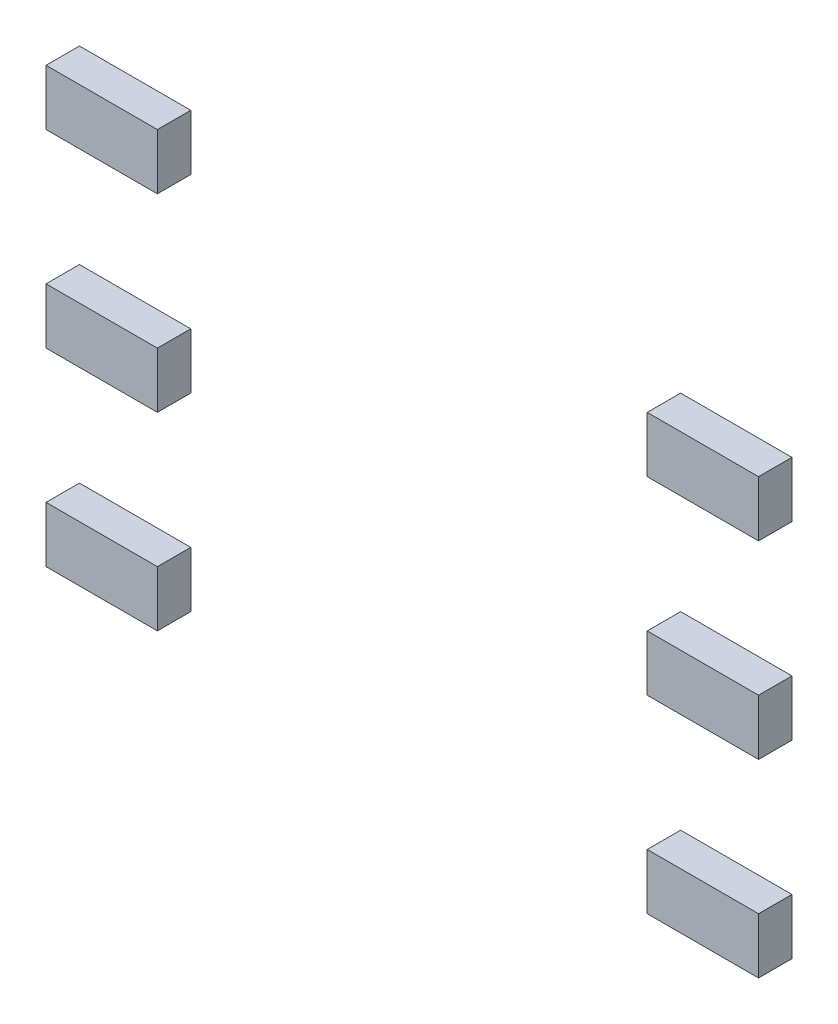
ISO-10303-21;
HEADER;
FILE_DESCRIPTION(('STEP AP214'),'2;1');
FILE_NAME('part.step','',(''),(''),'','','');
FILE_SCHEMA(('AUTOMOTIVE_DESIGN { 1 0 10303 214 1 1 1 1 }'));
ENDSEC;
DATA;
#1=APPLICATION_CONTEXT('core data for automotive mechanical design processes');
#2=APPLICATION_PROTOCOL_DEFINITION('international standard','automotive_design',2000,#1);
#3=PRODUCT_CONTEXT('',#1,'mechanical');
#4=PRODUCT('Part','Part','',(#3));
#5=PRODUCT_RELATED_PRODUCT_CATEGORY('part','',(#4));
#6=PRODUCT_DEFINITION_FORMATION('','',#4);
#7=PRODUCT_DEFINITION_CONTEXT('part definition',#1,'design');
#8=PRODUCT_DEFINITION('design','',#6,#7);
#9=PRODUCT_DEFINITION_SHAPE('','',#8);
#10=(LENGTH_UNIT() NAMED_UNIT(*) SI_UNIT(.MILLI.,.METRE.));
#11=(NAMED_UNIT(*) PLANE_ANGLE_UNIT() SI_UNIT($,.RADIAN.));
#12=(NAMED_UNIT(*) SI_UNIT($,.STERADIAN.) SOLID_ANGLE_UNIT());
#13=UNCERTAINTY_MEASURE_WITH_UNIT(LENGTH_MEASURE(1.E-05),#10,'distance_accuracy_value','');
#14=(GEOMETRIC_REPRESENTATION_CONTEXT(3) GLOBAL_UNCERTAINTY_ASSIGNED_CONTEXT((#13)) GLOBAL_UNIT_ASSIGNED_CONTEXT((#10,
#11,#12)) REPRESENTATION_CONTEXT('',''));
#15=CARTESIAN_POINT('',(0.,0.,0.));
#16=DIRECTION('',(0.,0.,1.));
#17=DIRECTION('',(1.,0.,0.));
#18=AXIS2_PLACEMENT_3D('',#15,#16,#17);
#19=CARTESIAN_POINT('',(-1.35,0.85,0.));
#20=DIRECTION('',(0.,0.,1.));
#21=DIRECTION('',(1.,0.,0.));
#22=AXIS2_PLACEMENT_3D('',#19,#20,#21);
#23=PLANE('',#22);
#24=DIRECTION('',(0.,-1.,0.));
#25=VECTOR('',#24,1.);
#26=CARTESIAN_POINT('',(-1.6,0.975,0.));
#27=LINE('',#26,#25);
#28=CARTESIAN_POINT('',(-1.6,0.975,0.));
#29=VERTEX_POINT('',#28);
#30=CARTESIAN_POINT('',(-1.6,0.725,0.));
#31=VERTEX_POINT('',#30);
#32=EDGE_CURVE('P0_E58',#29,#31,#27,.T.);
#33=ORIENTED_EDGE('',*,*,#32,.F.);
#34=DIRECTION('',(-1.,0.,0.));
#35=VECTOR('',#34,1.);
#36=CARTESIAN_POINT('',(-1.1,0.975,0.));
#37=LINE('',#36,#35);
#38=CARTESIAN_POINT('',(-1.1,0.975,0.));
#39=VERTEX_POINT('',#38);
#40=EDGE_CURVE('P0_E20',#39,#29,#37,.T.);
#41=ORIENTED_EDGE('',*,*,#40,.F.);
#42=DIRECTION('',(0.,1.,0.));
#43=VECTOR('',#42,1.);
#44=CARTESIAN_POINT('',(-1.1,0.725,0.));
#45=LINE('',#44,#43);
#46=CARTESIAN_POINT('',(-1.1,0.725,0.));
#47=VERTEX_POINT('',#46);
#48=EDGE_CURVE('P0_E88',#47,#39,#45,.T.);
#49=ORIENTED_EDGE('',*,*,#48,.F.);
#50=DIRECTION('',(1.,0.,0.));
#51=VECTOR('',#50,1.);
#52=CARTESIAN_POINT('',(-1.6,0.725,0.));
#53=LINE('',#52,#51);
#54=EDGE_CURVE('P0_E56',#31,#47,#53,.T.);
#55=ORIENTED_EDGE('',*,*,#54,.F.);
#56=EDGE_LOOP('',(#33,#41,#49,#55));
#57=FACE_BOUND('',#56,.T.);
#58=ADVANCED_FACE('P0_F17',(#57),#23,.F.);
#59=CARTESIAN_POINT('',(-1.1,0.975,0.));
#60=DIRECTION('',(0.,1.,0.));
#61=DIRECTION('',(-1.,0.,0.));
#62=AXIS2_PLACEMENT_3D('',#59,#60,#61);
#63=PLANE('',#62);
#64=DIRECTION('',(1.,0.,0.));
#65=VECTOR('',#64,1.);
#66=CARTESIAN_POINT('',(-1.35,0.975,0.15));
#67=LINE('',#66,#65);
#68=CARTESIAN_POINT('',(-1.1,0.975,0.15));
#69=VERTEX_POINT('',#68);
#70=CARTESIAN_POINT('',(-1.6,0.975,0.15));
#71=VERTEX_POINT('',#70);
#72=EDGE_CURVE('P0_E95',#69,#71,#67,.F.);
#73=ORIENTED_EDGE('',*,*,#72,.F.);
#74=DIRECTION('',(0.,0.,1.));
#75=VECTOR('',#74,1.);
#76=CARTESIAN_POINT('',(-1.1,0.975,0.));
#77=LINE('',#76,#75);
#78=EDGE_CURVE('P0_E70',#39,#69,#77,.T.);
#79=ORIENTED_EDGE('',*,*,#78,.F.);
#80=ORIENTED_EDGE('',*,*,#40,.T.);
#81=DIRECTION('',(0.,0.,1.));
#82=VECTOR('',#81,1.);
#83=CARTESIAN_POINT('',(-1.6,0.975,0.));
#84=LINE('',#83,#82);
#85=EDGE_CURVE('P0_E65',#71,#29,#84,.F.);
#86=ORIENTED_EDGE('',*,*,#85,.F.);
#87=EDGE_LOOP('',(#73,#79,#80,#86));
#88=FACE_BOUND('',#87,.T.);
#89=ADVANCED_FACE('P0_F67',(#88),#63,.T.);
#90=CARTESIAN_POINT('',(-1.6,0.975,0.));
#91=DIRECTION('',(-1.,0.,0.));
#92=DIRECTION('',(0.,-1.,0.));
#93=AXIS2_PLACEMENT_3D('',#90,#91,#92);
#94=PLANE('',#93);
#95=DIRECTION('',(0.,1.,0.));
#96=VECTOR('',#95,1.);
#97=CARTESIAN_POINT('',(-1.6,0.85,0.15));
#98=LINE('',#97,#96);
#99=CARTESIAN_POINT('',(-1.6,0.725,0.15));
#100=VERTEX_POINT('',#99);
#101=EDGE_CURVE('P0_E75',#71,#100,#98,.F.);
#102=ORIENTED_EDGE('',*,*,#101,.F.);
#103=ORIENTED_EDGE('',*,*,#85,.T.);
#104=ORIENTED_EDGE('',*,*,#32,.T.);
#105=DIRECTION('',(0.,0.,1.));
#106=VECTOR('',#105,1.);
#107=CARTESIAN_POINT('',(-1.6,0.725,0.));
#108=LINE('',#107,#106);
#109=EDGE_CURVE('P0_E83',#100,#31,#108,.F.);
#110=ORIENTED_EDGE('',*,*,#109,.F.);
#111=EDGE_LOOP('',(#102,#103,#104,#110));
#112=FACE_BOUND('',#111,.T.);
#113=ADVANCED_FACE('P0_F73',(#112),#94,.T.);
#114=CARTESIAN_POINT('',(-1.6,0.725,0.));
#115=DIRECTION('',(0.,-1.,0.));
#116=DIRECTION('',(1.,0.,0.));
#117=AXIS2_PLACEMENT_3D('',#114,#115,#116);
#118=PLANE('',#117);
#119=DIRECTION('',(1.,0.,0.));
#120=VECTOR('',#119,1.);
#121=CARTESIAN_POINT('',(-1.35,0.725,0.15));
#122=LINE('',#121,#120);
#123=CARTESIAN_POINT('',(-1.1,0.725,0.15));
#124=VERTEX_POINT('',#123);
#125=EDGE_CURVE('P0_E27',#100,#124,#122,.T.);
#126=ORIENTED_EDGE('',*,*,#125,.F.);
#127=ORIENTED_EDGE('',*,*,#109,.T.);
#128=ORIENTED_EDGE('',*,*,#54,.T.);
#129=DIRECTION('',(0.,0.,1.));
#130=VECTOR('',#129,1.);
#131=CARTESIAN_POINT('',(-1.1,0.725,0.));
#132=LINE('',#131,#130);
#133=EDGE_CURVE('P0_E36',#124,#47,#132,.F.);
#134=ORIENTED_EDGE('',*,*,#133,.F.);
#135=EDGE_LOOP('',(#126,#127,#128,#134));
#136=FACE_BOUND('',#135,.T.);
#137=ADVANCED_FACE('P0_F102',(#136),#118,.T.);
#138=CARTESIAN_POINT('',(-1.1,0.725,0.));
#139=DIRECTION('',(1.,0.,0.));
#140=DIRECTION('',(0.,1.,0.));
#141=AXIS2_PLACEMENT_3D('',#138,#139,#140);
#142=PLANE('',#141);
#143=DIRECTION('',(0.,1.,0.));
#144=VECTOR('',#143,1.);
#145=CARTESIAN_POINT('',(-1.1,0.85,0.15));
#146=LINE('',#145,#144);
#147=EDGE_CURVE('P0_E11',#124,#69,#146,.T.);
#148=ORIENTED_EDGE('',*,*,#147,.F.);
#149=ORIENTED_EDGE('',*,*,#133,.T.);
#150=ORIENTED_EDGE('',*,*,#48,.T.);
#151=ORIENTED_EDGE('',*,*,#78,.T.);
#152=EDGE_LOOP('',(#148,#149,#150,#151));
#153=FACE_BOUND('',#152,.T.);
#154=ADVANCED_FACE('P0_F104',(#153),#142,.T.);
#155=CARTESIAN_POINT('',(-1.35,0.85,0.15));
#156=DIRECTION('',(0.,0.,1.));
#157=DIRECTION('',(1.,0.,0.));
#158=AXIS2_PLACEMENT_3D('',#155,#156,#157);
#159=PLANE('',#158);
#160=ORIENTED_EDGE('',*,*,#125,.T.);
#161=ORIENTED_EDGE('',*,*,#147,.T.);
#162=ORIENTED_EDGE('',*,*,#72,.T.);
#163=ORIENTED_EDGE('',*,*,#101,.T.);
#164=EDGE_LOOP('',(#160,#161,#162,#163));
#165=FACE_BOUND('',#164,.T.);
#166=ADVANCED_FACE('P0_F101',(#165),#159,.T.);
#167=CLOSED_SHELL('',(#58,#89,#113,#137,#154,#166));
#168=MANIFOLD_SOLID_BREP('P0_B1',#167);
#169=CARTESIAN_POINT('',(1.35,-0.85,0.));
#170=DIRECTION('',(0.,0.,1.));
#171=DIRECTION('',(1.,0.,0.));
#172=AXIS2_PLACEMENT_3D('',#169,#170,#171);
#173=PLANE('',#172);
#174=DIRECTION('',(0.,1.,0.));
#175=VECTOR('',#174,1.);
#176=CARTESIAN_POINT('',(1.6,-0.975,0.));
#177=LINE('',#176,#175);
#178=CARTESIAN_POINT('',(1.6,-0.975,0.));
#179=VERTEX_POINT('',#178);
#180=CARTESIAN_POINT('',(1.6,-0.725,0.));
#181=VERTEX_POINT('',#180);
#182=EDGE_CURVE('P1_E58',#179,#181,#177,.T.);
#183=ORIENTED_EDGE('',*,*,#182,.F.);
#184=DIRECTION('',(1.,0.,0.));
#185=VECTOR('',#184,1.);
#186=CARTESIAN_POINT('',(1.1,-0.975,0.));
#187=LINE('',#186,#185);
#188=CARTESIAN_POINT('',(1.1,-0.975,0.));
#189=VERTEX_POINT('',#188);
#190=EDGE_CURVE('P1_E20',#189,#179,#187,.T.);
#191=ORIENTED_EDGE('',*,*,#190,.F.);
#192=DIRECTION('',(0.,1.,0.));
#193=VECTOR('',#192,1.);
#194=CARTESIAN_POINT('',(1.1,-0.725,0.));
#195=LINE('',#194,#193);
#196=CARTESIAN_POINT('',(1.1,-0.725,0.));
#197=VERTEX_POINT('',#196);
#198=EDGE_CURVE('P1_E87',#197,#189,#195,.F.);
#199=ORIENTED_EDGE('',*,*,#198,.F.);
#200=DIRECTION('',(1.,0.,0.));
#201=VECTOR('',#200,1.);
#202=CARTESIAN_POINT('',(1.6,-0.725,0.));
#203=LINE('',#202,#201);
#204=EDGE_CURVE('P1_E56',#181,#197,#203,.F.);
#205=ORIENTED_EDGE('',*,*,#204,.F.);
#206=EDGE_LOOP('',(#183,#191,#199,#205));
#207=FACE_BOUND('',#206,.T.);
#208=ADVANCED_FACE('P1_F17',(#207),#173,.F.);
#209=CARTESIAN_POINT('',(1.1,-0.975,0.));
#210=DIRECTION('',(0.,-1.,0.));
#211=DIRECTION('',(0.,0.,-1.));
#212=AXIS2_PLACEMENT_3D('',#209,#210,#211);
#213=PLANE('',#212);
#214=DIRECTION('',(1.,0.,0.));
#215=VECTOR('',#214,1.);
#216=CARTESIAN_POINT('',(1.35,-0.975,0.15));
#217=LINE('',#216,#215);
#218=CARTESIAN_POINT('',(1.1,-0.975,0.15));
#219=VERTEX_POINT('',#218);
#220=CARTESIAN_POINT('',(1.6,-0.975,0.15));
#221=VERTEX_POINT('',#220);
#222=EDGE_CURVE('P1_E94',#219,#221,#217,.T.);
#223=ORIENTED_EDGE('',*,*,#222,.F.);
#224=DIRECTION('',(0.,0.,1.));
#225=VECTOR('',#224,1.);
#226=CARTESIAN_POINT('',(1.1,-0.975,0.));
#227=LINE('',#226,#225);
#228=EDGE_CURVE('P1_E70',#189,#219,#227,.T.);
#229=ORIENTED_EDGE('',*,*,#228,.F.);
#230=ORIENTED_EDGE('',*,*,#190,.T.);
#231=DIRECTION('',(0.,0.,-1.));
#232=VECTOR('',#231,1.);
#233=CARTESIAN_POINT('',(1.6,-0.975,0.));
#234=LINE('',#233,#232);
#235=EDGE_CURVE('P1_E65',#221,#179,#234,.T.);
#236=ORIENTED_EDGE('',*,*,#235,.F.);
#237=EDGE_LOOP('',(#223,#229,#230,#236));
#238=FACE_BOUND('',#237,.T.);
#239=ADVANCED_FACE('P1_F67',(#238),#213,.T.);
#240=CARTESIAN_POINT('',(1.6,-0.975,0.));
#241=DIRECTION('',(1.,0.,0.));
#242=DIRECTION('',(0.,0.,-1.));
#243=AXIS2_PLACEMENT_3D('',#240,#241,#242);
#244=PLANE('',#243);
#245=DIRECTION('',(0.,1.,0.));
#246=VECTOR('',#245,1.);
#247=CARTESIAN_POINT('',(1.6,-0.85,0.15));
#248=LINE('',#247,#246);
#249=CARTESIAN_POINT('',(1.6,-0.725,0.15));
#250=VERTEX_POINT('',#249);
#251=EDGE_CURVE('P1_E75',#221,#250,#248,.T.);
#252=ORIENTED_EDGE('',*,*,#251,.F.);
#253=ORIENTED_EDGE('',*,*,#235,.T.);
#254=ORIENTED_EDGE('',*,*,#182,.T.);
#255=DIRECTION('',(0.,0.,1.));
#256=VECTOR('',#255,1.);
#257=CARTESIAN_POINT('',(1.6,-0.725,0.));
#258=LINE('',#257,#256);
#259=EDGE_CURVE('P1_E82',#250,#181,#258,.F.);
#260=ORIENTED_EDGE('',*,*,#259,.F.);
#261=EDGE_LOOP('',(#252,#253,#254,#260));
#262=FACE_BOUND('',#261,.T.);
#263=ADVANCED_FACE('P1_F73',(#262),#244,.T.);
#264=CARTESIAN_POINT('',(1.6,-0.725,0.));
#265=DIRECTION('',(0.,1.,0.));
#266=DIRECTION('',(0.,0.,1.));
#267=AXIS2_PLACEMENT_3D('',#264,#265,#266);
#268=PLANE('',#267);
#269=DIRECTION('',(1.,0.,0.));
#270=VECTOR('',#269,1.);
#271=CARTESIAN_POINT('',(1.35,-0.725,0.15));
#272=LINE('',#271,#270);
#273=CARTESIAN_POINT('',(1.1,-0.725,0.15));
#274=VERTEX_POINT('',#273);
#275=EDGE_CURVE('P1_E27',#250,#274,#272,.F.);
#276=ORIENTED_EDGE('',*,*,#275,.F.);
#277=ORIENTED_EDGE('',*,*,#259,.T.);
#278=ORIENTED_EDGE('',*,*,#204,.T.);
#279=DIRECTION('',(0.,0.,1.));
#280=VECTOR('',#279,1.);
#281=CARTESIAN_POINT('',(1.1,-0.725,0.));
#282=LINE('',#281,#280);
#283=EDGE_CURVE('P1_E36',#274,#197,#282,.F.);
#284=ORIENTED_EDGE('',*,*,#283,.F.);
#285=EDGE_LOOP('',(#276,#277,#278,#284));
#286=FACE_BOUND('',#285,.T.);
#287=ADVANCED_FACE('P1_F102',(#286),#268,.T.);
#288=CARTESIAN_POINT('',(1.1,-0.725,0.));
#289=DIRECTION('',(-1.,0.,0.));
#290=DIRECTION('',(0.,0.,1.));
#291=AXIS2_PLACEMENT_3D('',#288,#289,#290);
#292=PLANE('',#291);
#293=DIRECTION('',(0.,1.,0.));
#294=VECTOR('',#293,1.);
#295=CARTESIAN_POINT('',(1.1,-0.85,0.15));
#296=LINE('',#295,#294);
#297=EDGE_CURVE('P1_E11',#274,#219,#296,.F.);
#298=ORIENTED_EDGE('',*,*,#297,.F.);
#299=ORIENTED_EDGE('',*,*,#283,.T.);
#300=ORIENTED_EDGE('',*,*,#198,.T.);
#301=ORIENTED_EDGE('',*,*,#228,.T.);
#302=EDGE_LOOP('',(#298,#299,#300,#301));
#303=FACE_BOUND('',#302,.T.);
#304=ADVANCED_FACE('P1_F104',(#303),#292,.T.);
#305=CARTESIAN_POINT('',(1.35,-0.85,0.15));
#306=DIRECTION('',(0.,0.,1.));
#307=DIRECTION('',(1.,0.,0.));
#308=AXIS2_PLACEMENT_3D('',#305,#306,#307);
#309=PLANE('',#308);
#310=ORIENTED_EDGE('',*,*,#275,.T.);
#311=ORIENTED_EDGE('',*,*,#297,.T.);
#312=ORIENTED_EDGE('',*,*,#222,.T.);
#313=ORIENTED_EDGE('',*,*,#251,.T.);
#314=EDGE_LOOP('',(#310,#311,#312,#313));
#315=FACE_BOUND('',#314,.T.);
#316=ADVANCED_FACE('P1_F101',(#315),#309,.T.);
#317=CLOSED_SHELL('',(#208,#239,#263,#287,#304,#316));
#318=MANIFOLD_SOLID_BREP('P1_B1',#317);
#319=CARTESIAN_POINT('',(-1.35,-0.85,0.));
#320=DIRECTION('',(0.,0.,1.));
#321=DIRECTION('',(1.,0.,0.));
#322=AXIS2_PLACEMENT_3D('',#319,#320,#321);
#323=PLANE('',#322);
#324=DIRECTION('',(0.,-1.,0.));
#325=VECTOR('',#324,1.);
#326=CARTESIAN_POINT('',(-1.6,-0.725,0.));
#327=LINE('',#326,#325);
#328=CARTESIAN_POINT('',(-1.6,-0.725,0.));
#329=VERTEX_POINT('',#328);
#330=CARTESIAN_POINT('',(-1.6,-0.975,0.));
#331=VERTEX_POINT('',#330);
#332=EDGE_CURVE('P2_E58',#329,#331,#327,.T.);
#333=ORIENTED_EDGE('',*,*,#332,.F.);
#334=DIRECTION('',(-1.,0.,0.));
#335=VECTOR('',#334,1.);
#336=CARTESIAN_POINT('',(-1.1,-0.725,0.));
#337=LINE('',#336,#335);
#338=CARTESIAN_POINT('',(-1.1,-0.725,0.));
#339=VERTEX_POINT('',#338);
#340=EDGE_CURVE('P2_E20',#339,#329,#337,.T.);
#341=ORIENTED_EDGE('',*,*,#340,.F.);
#342=DIRECTION('',(0.,1.,0.));
#343=VECTOR('',#342,1.);
#344=CARTESIAN_POINT('',(-1.1,-0.975,0.));
#345=LINE('',#344,#343);
#346=CARTESIAN_POINT('',(-1.1,-0.975,0.));
#347=VERTEX_POINT('',#346);
#348=EDGE_CURVE('P2_E88',#347,#339,#345,.T.);
#349=ORIENTED_EDGE('',*,*,#348,.F.);
#350=DIRECTION('',(1.,0.,0.));
#351=VECTOR('',#350,1.);
#352=CARTESIAN_POINT('',(-1.6,-0.975,0.));
#353=LINE('',#352,#351);
#354=EDGE_CURVE('P2_E56',#331,#347,#353,.T.);
#355=ORIENTED_EDGE('',*,*,#354,.F.);
#356=EDGE_LOOP('',(#333,#341,#349,#355));
#357=FACE_BOUND('',#356,.T.);
#358=ADVANCED_FACE('P2_F17',(#357),#323,.F.);
#359=CARTESIAN_POINT('',(-1.1,-0.725,0.));
#360=DIRECTION('',(0.,1.,0.));
#361=DIRECTION('',(-1.,0.,0.));
#362=AXIS2_PLACEMENT_3D('',#359,#360,#361);
#363=PLANE('',#362);
#364=DIRECTION('',(1.,0.,0.));
#365=VECTOR('',#364,1.);
#366=CARTESIAN_POINT('',(-1.35,-0.725,0.15));
#367=LINE('',#366,#365);
#368=CARTESIAN_POINT('',(-1.1,-0.725,0.15));
#369=VERTEX_POINT('',#368);
#370=CARTESIAN_POINT('',(-1.6,-0.725,0.15));
#371=VERTEX_POINT('',#370);
#372=EDGE_CURVE('P2_E94',#369,#371,#367,.F.);
#373=ORIENTED_EDGE('',*,*,#372,.F.);
#374=DIRECTION('',(0.,0.,1.));
#375=VECTOR('',#374,1.);
#376=CARTESIAN_POINT('',(-1.1,-0.725,0.));
#377=LINE('',#376,#375);
#378=EDGE_CURVE('P2_E70',#339,#369,#377,.T.);
#379=ORIENTED_EDGE('',*,*,#378,.F.);
#380=ORIENTED_EDGE('',*,*,#340,.T.);
#381=DIRECTION('',(0.,0.,1.));
#382=VECTOR('',#381,1.);
#383=CARTESIAN_POINT('',(-1.6,-0.725,0.));
#384=LINE('',#383,#382);
#385=EDGE_CURVE('P2_E65',#371,#329,#384,.F.);
#386=ORIENTED_EDGE('',*,*,#385,.F.);
#387=EDGE_LOOP('',(#373,#379,#380,#386));
#388=FACE_BOUND('',#387,.T.);
#389=ADVANCED_FACE('P2_F67',(#388),#363,.T.);
#390=CARTESIAN_POINT('',(-1.6,-0.725,0.));
#391=DIRECTION('',(-1.,0.,0.));
#392=DIRECTION('',(0.,-1.,0.));
#393=AXIS2_PLACEMENT_3D('',#390,#391,#392);
#394=PLANE('',#393);
#395=DIRECTION('',(0.,1.,0.));
#396=VECTOR('',#395,1.);
#397=CARTESIAN_POINT('',(-1.6,-0.85,0.15));
#398=LINE('',#397,#396);
#399=CARTESIAN_POINT('',(-1.6,-0.975,0.15));
#400=VERTEX_POINT('',#399);
#401=EDGE_CURVE('P2_E75',#371,#400,#398,.F.);
#402=ORIENTED_EDGE('',*,*,#401,.F.);
#403=ORIENTED_EDGE('',*,*,#385,.T.);
#404=ORIENTED_EDGE('',*,*,#332,.T.);
#405=DIRECTION('',(0.,0.,1.));
#406=VECTOR('',#405,1.);
#407=CARTESIAN_POINT('',(-1.6,-0.975,0.));
#408=LINE('',#407,#406);
#409=EDGE_CURVE('P2_E83',#400,#331,#408,.F.);
#410=ORIENTED_EDGE('',*,*,#409,.F.);
#411=EDGE_LOOP('',(#402,#403,#404,#410));
#412=FACE_BOUND('',#411,.T.);
#413=ADVANCED_FACE('P2_F73',(#412),#394,.T.);
#414=CARTESIAN_POINT('',(-1.6,-0.975,0.));
#415=DIRECTION('',(0.,-1.,0.));
#416=DIRECTION('',(1.,0.,0.));
#417=AXIS2_PLACEMENT_3D('',#414,#415,#416);
#418=PLANE('',#417);
#419=DIRECTION('',(1.,0.,0.));
#420=VECTOR('',#419,1.);
#421=CARTESIAN_POINT('',(-1.35,-0.975,0.15));
#422=LINE('',#421,#420);
#423=CARTESIAN_POINT('',(-1.1,-0.975,0.15));
#424=VERTEX_POINT('',#423);
#425=EDGE_CURVE('P2_E27',#400,#424,#422,.T.);
#426=ORIENTED_EDGE('',*,*,#425,.F.);
#427=ORIENTED_EDGE('',*,*,#409,.T.);
#428=ORIENTED_EDGE('',*,*,#354,.T.);
#429=DIRECTION('',(0.,0.,1.));
#430=VECTOR('',#429,1.);
#431=CARTESIAN_POINT('',(-1.1,-0.975,0.));
#432=LINE('',#431,#430);
#433=EDGE_CURVE('P2_E36',#424,#347,#432,.F.);
#434=ORIENTED_EDGE('',*,*,#433,.F.);
#435=EDGE_LOOP('',(#426,#427,#428,#434));
#436=FACE_BOUND('',#435,.T.);
#437=ADVANCED_FACE('P2_F102',(#436),#418,.T.);
#438=CARTESIAN_POINT('',(-1.1,-0.975,0.));
#439=DIRECTION('',(1.,0.,0.));
#440=DIRECTION('',(0.,1.,0.));
#441=AXIS2_PLACEMENT_3D('',#438,#439,#440);
#442=PLANE('',#441);
#443=DIRECTION('',(0.,1.,0.));
#444=VECTOR('',#443,1.);
#445=CARTESIAN_POINT('',(-1.1,-0.85,0.15));
#446=LINE('',#445,#444);
#447=EDGE_CURVE('P2_E11',#424,#369,#446,.T.);
#448=ORIENTED_EDGE('',*,*,#447,.F.);
#449=ORIENTED_EDGE('',*,*,#433,.T.);
#450=ORIENTED_EDGE('',*,*,#348,.T.);
#451=ORIENTED_EDGE('',*,*,#378,.T.);
#452=EDGE_LOOP('',(#448,#449,#450,#451));
#453=FACE_BOUND('',#452,.T.);
#454=ADVANCED_FACE('P2_F104',(#453),#442,.T.);
#455=CARTESIAN_POINT('',(-1.35,-0.85,0.15));
#456=DIRECTION('',(0.,0.,1.));
#457=DIRECTION('',(1.,0.,0.));
#458=AXIS2_PLACEMENT_3D('',#455,#456,#457);
#459=PLANE('',#458);
#460=ORIENTED_EDGE('',*,*,#425,.T.);
#461=ORIENTED_EDGE('',*,*,#447,.T.);
#462=ORIENTED_EDGE('',*,*,#372,.T.);
#463=ORIENTED_EDGE('',*,*,#401,.T.);
#464=EDGE_LOOP('',(#460,#461,#462,#463));
#465=FACE_BOUND('',#464,.T.);
#466=ADVANCED_FACE('P2_F101',(#465),#459,.T.);
#467=CLOSED_SHELL('',(#358,#389,#413,#437,#454,#466));
#468=MANIFOLD_SOLID_BREP('P2_B1',#467);
#469=CARTESIAN_POINT('',(1.35,0.85,0.));
#470=DIRECTION('',(0.,0.,1.));
#471=DIRECTION('',(1.,0.,0.));
#472=AXIS2_PLACEMENT_3D('',#469,#470,#471);
#473=PLANE('',#472);
#474=DIRECTION('',(0.,1.,0.));
#475=VECTOR('',#474,1.);
#476=CARTESIAN_POINT('',(1.6,0.725,0.));
#477=LINE('',#476,#475);
#478=CARTESIAN_POINT('',(1.6,0.725,0.));
#479=VERTEX_POINT('',#478);
#480=CARTESIAN_POINT('',(1.6,0.975,0.));
#481=VERTEX_POINT('',#480);
#482=EDGE_CURVE('P3_E58',#479,#481,#477,.T.);
#483=ORIENTED_EDGE('',*,*,#482,.F.);
#484=DIRECTION('',(1.,0.,0.));
#485=VECTOR('',#484,1.);
#486=CARTESIAN_POINT('',(1.1,0.725,0.));
#487=LINE('',#486,#485);
#488=CARTESIAN_POINT('',(1.1,0.725,0.));
#489=VERTEX_POINT('',#488);
#490=EDGE_CURVE('P3_E20',#489,#479,#487,.T.);
#491=ORIENTED_EDGE('',*,*,#490,.F.);
#492=DIRECTION('',(0.,1.,0.));
#493=VECTOR('',#492,1.);
#494=CARTESIAN_POINT('',(1.1,0.975,0.));
#495=LINE('',#494,#493);
#496=CARTESIAN_POINT('',(1.1,0.975,0.));
#497=VERTEX_POINT('',#496);
#498=EDGE_CURVE('P3_E86',#497,#489,#495,.F.);
#499=ORIENTED_EDGE('',*,*,#498,.F.);
#500=DIRECTION('',(1.,0.,0.));
#501=VECTOR('',#500,1.);
#502=CARTESIAN_POINT('',(1.6,0.975,0.));
#503=LINE('',#502,#501);
#504=EDGE_CURVE('P3_E56',#481,#497,#503,.F.);
#505=ORIENTED_EDGE('',*,*,#504,.F.);
#506=EDGE_LOOP('',(#483,#491,#499,#505));
#507=FACE_BOUND('',#506,.T.);
#508=ADVANCED_FACE('P3_F17',(#507),#473,.F.);
#509=CARTESIAN_POINT('',(1.1,0.725,0.));
#510=DIRECTION('',(0.,-1.,0.));
#511=DIRECTION('',(0.,0.,-1.));
#512=AXIS2_PLACEMENT_3D('',#509,#510,#511);
#513=PLANE('',#512);
#514=DIRECTION('',(1.,0.,0.));
#515=VECTOR('',#514,1.);
#516=CARTESIAN_POINT('',(1.35,0.725,0.15));
#517=LINE('',#516,#515);
#518=CARTESIAN_POINT('',(1.1,0.725,0.15));
#519=VERTEX_POINT('',#518);
#520=CARTESIAN_POINT('',(1.6,0.725,0.15));
#521=VERTEX_POINT('',#520);
#522=EDGE_CURVE('P3_E93',#519,#521,#517,.T.);
#523=ORIENTED_EDGE('',*,*,#522,.F.);
#524=DIRECTION('',(0.,0.,1.));
#525=VECTOR('',#524,1.);
#526=CARTESIAN_POINT('',(1.1,0.725,0.));
#527=LINE('',#526,#525);
#528=EDGE_CURVE('P3_E70',#489,#519,#527,.T.);
#529=ORIENTED_EDGE('',*,*,#528,.F.);
#530=ORIENTED_EDGE('',*,*,#490,.T.);
#531=DIRECTION('',(0.,0.,-1.));
#532=VECTOR('',#531,1.);
#533=CARTESIAN_POINT('',(1.6,0.725,0.));
#534=LINE('',#533,#532);
#535=EDGE_CURVE('P3_E65',#521,#479,#534,.T.);
#536=ORIENTED_EDGE('',*,*,#535,.F.);
#537=EDGE_LOOP('',(#523,#529,#530,#536));
#538=FACE_BOUND('',#537,.T.);
#539=ADVANCED_FACE('P3_F67',(#538),#513,.T.);
#540=CARTESIAN_POINT('',(1.6,0.725,0.));
#541=DIRECTION('',(1.,0.,0.));
#542=DIRECTION('',(0.,0.,-1.));
#543=AXIS2_PLACEMENT_3D('',#540,#541,#542);
#544=PLANE('',#543);
#545=DIRECTION('',(0.,1.,0.));
#546=VECTOR('',#545,1.);
#547=CARTESIAN_POINT('',(1.6,0.85,0.15));
#548=LINE('',#547,#546);
#549=CARTESIAN_POINT('',(1.6,0.975,0.15));
#550=VERTEX_POINT('',#549);
#551=EDGE_CURVE('P3_E75',#521,#550,#548,.T.);
#552=ORIENTED_EDGE('',*,*,#551,.F.);
#553=ORIENTED_EDGE('',*,*,#535,.T.);
#554=ORIENTED_EDGE('',*,*,#482,.T.);
#555=DIRECTION('',(0.,0.,1.));
#556=VECTOR('',#555,1.);
#557=CARTESIAN_POINT('',(1.6,0.975,0.));
#558=LINE('',#557,#556);
#559=EDGE_CURVE('P3_E81',#550,#481,#558,.F.);
#560=ORIENTED_EDGE('',*,*,#559,.F.);
#561=EDGE_LOOP('',(#552,#553,#554,#560));
#562=FACE_BOUND('',#561,.T.);
#563=ADVANCED_FACE('P3_F73',(#562),#544,.T.);
#564=CARTESIAN_POINT('',(1.6,0.975,0.));
#565=DIRECTION('',(0.,1.,0.));
#566=DIRECTION('',(0.,0.,1.));
#567=AXIS2_PLACEMENT_3D('',#564,#565,#566);
#568=PLANE('',#567);
#569=DIRECTION('',(1.,0.,0.));
#570=VECTOR('',#569,1.);
#571=CARTESIAN_POINT('',(1.35,0.975,0.15));
#572=LINE('',#571,#570);
#573=CARTESIAN_POINT('',(1.1,0.975,0.15));
#574=VERTEX_POINT('',#573);
#575=EDGE_CURVE('P3_E27',#550,#574,#572,.F.);
#576=ORIENTED_EDGE('',*,*,#575,.F.);
#577=ORIENTED_EDGE('',*,*,#559,.T.);
#578=ORIENTED_EDGE('',*,*,#504,.T.);
#579=DIRECTION('',(0.,0.,1.));
#580=VECTOR('',#579,1.);
#581=CARTESIAN_POINT('',(1.1,0.975,0.));
#582=LINE('',#581,#580);
#583=EDGE_CURVE('P3_E36',#574,#497,#582,.F.);
#584=ORIENTED_EDGE('',*,*,#583,.F.);
#585=EDGE_LOOP('',(#576,#577,#578,#584));
#586=FACE_BOUND('',#585,.T.);
#587=ADVANCED_FACE('P3_F102',(#586),#568,.T.);
#588=CARTESIAN_POINT('',(1.1,0.975,0.));
#589=DIRECTION('',(-1.,0.,0.));
#590=DIRECTION('',(0.,0.,1.));
#591=AXIS2_PLACEMENT_3D('',#588,#589,#590);
#592=PLANE('',#591);
#593=DIRECTION('',(0.,1.,0.));
#594=VECTOR('',#593,1.);
#595=CARTESIAN_POINT('',(1.1,0.85,0.15));
#596=LINE('',#595,#594);
#597=EDGE_CURVE('P3_E11',#574,#519,#596,.F.);
#598=ORIENTED_EDGE('',*,*,#597,.F.);
#599=ORIENTED_EDGE('',*,*,#583,.T.);
#600=ORIENTED_EDGE('',*,*,#498,.T.);
#601=ORIENTED_EDGE('',*,*,#528,.T.);
#602=EDGE_LOOP('',(#598,#599,#600,#601));
#603=FACE_BOUND('',#602,.T.);
#604=ADVANCED_FACE('P3_F104',(#603),#592,.T.);
#605=CARTESIAN_POINT('',(1.35,0.85,0.15));
#606=DIRECTION('',(0.,0.,1.));
#607=DIRECTION('',(1.,0.,0.));
#608=AXIS2_PLACEMENT_3D('',#605,#606,#607);
#609=PLANE('',#608);
#610=ORIENTED_EDGE('',*,*,#575,.T.);
#611=ORIENTED_EDGE('',*,*,#597,.T.);
#612=ORIENTED_EDGE('',*,*,#522,.T.);
#613=ORIENTED_EDGE('',*,*,#551,.T.);
#614=EDGE_LOOP('',(#610,#611,#612,#613));
#615=FACE_BOUND('',#614,.T.);
#616=ADVANCED_FACE('P3_F101',(#615),#609,.T.);
#617=CLOSED_SHELL('',(#508,#539,#563,#587,#604,#616));
#618=MANIFOLD_SOLID_BREP('P3_B1',#617);
#619=CARTESIAN_POINT('',(1.35,0.,0.));
#620=DIRECTION('',(0.,0.,1.));
#621=DIRECTION('',(1.,0.,0.));
#622=AXIS2_PLACEMENT_3D('',#619,#620,#621);
#623=PLANE('',#622);
#624=DIRECTION('',(0.,1.,0.));
#625=VECTOR('',#624,1.);
#626=CARTESIAN_POINT('',(1.6,-0.125,0.));
#627=LINE('',#626,#625);
#628=CARTESIAN_POINT('',(1.6,-0.125,0.));
#629=VERTEX_POINT('',#628);
#630=CARTESIAN_POINT('',(1.6,0.125,0.));
#631=VERTEX_POINT('',#630);
#632=EDGE_CURVE('P4_E58',#629,#631,#627,.T.);
#633=ORIENTED_EDGE('',*,*,#632,.F.);
#634=DIRECTION('',(1.,0.,0.));
#635=VECTOR('',#634,1.);
#636=CARTESIAN_POINT('',(1.1,-0.125,0.));
#637=LINE('',#636,#635);
#638=CARTESIAN_POINT('',(1.1,-0.125,0.));
#639=VERTEX_POINT('',#638);
#640=EDGE_CURVE('P4_E20',#639,#629,#637,.T.);
#641=ORIENTED_EDGE('',*,*,#640,.F.);
#642=DIRECTION('',(0.,1.,0.));
#643=VECTOR('',#642,1.);
#644=CARTESIAN_POINT('',(1.1,0.125,0.));
#645=LINE('',#644,#643);
#646=CARTESIAN_POINT('',(1.1,0.125,0.));
#647=VERTEX_POINT('',#646);
#648=EDGE_CURVE('P4_E88',#647,#639,#645,.F.);
#649=ORIENTED_EDGE('',*,*,#648,.F.);
#650=DIRECTION('',(1.,0.,0.));
#651=VECTOR('',#650,1.);
#652=CARTESIAN_POINT('',(1.6,0.125,0.));
#653=LINE('',#652,#651);
#654=EDGE_CURVE('P4_E56',#631,#647,#653,.F.);
#655=ORIENTED_EDGE('',*,*,#654,.F.);
#656=EDGE_LOOP('',(#633,#641,#649,#655));
#657=FACE_BOUND('',#656,.T.);
#658=ADVANCED_FACE('P4_F17',(#657),#623,.F.);
#659=CARTESIAN_POINT('',(1.1,-0.125,0.));
#660=DIRECTION('',(0.,-1.,0.));
#661=DIRECTION('',(0.,0.,-1.));
#662=AXIS2_PLACEMENT_3D('',#659,#660,#661);
#663=PLANE('',#662);
#664=DIRECTION('',(1.,0.,0.));
#665=VECTOR('',#664,1.);
#666=CARTESIAN_POINT('',(1.35,-0.125,0.15));
#667=LINE('',#666,#665);
#668=CARTESIAN_POINT('',(1.1,-0.125,0.15));
#669=VERTEX_POINT('',#668);
#670=CARTESIAN_POINT('',(1.6,-0.125,0.15));
#671=VERTEX_POINT('',#670);
#672=EDGE_CURVE('P4_E94',#669,#671,#667,.T.);
#673=ORIENTED_EDGE('',*,*,#672,.F.);
#674=DIRECTION('',(0.,0.,1.));
#675=VECTOR('',#674,1.);
#676=CARTESIAN_POINT('',(1.1,-0.125,0.));
#677=LINE('',#676,#675);
#678=EDGE_CURVE('P4_E70',#639,#669,#677,.T.);
#679=ORIENTED_EDGE('',*,*,#678,.F.);
#680=ORIENTED_EDGE('',*,*,#640,.T.);
#681=DIRECTION('',(0.,0.,-1.));
#682=VECTOR('',#681,1.);
#683=CARTESIAN_POINT('',(1.6,-0.125,0.));
#684=LINE('',#683,#682);
#685=EDGE_CURVE('P4_E65',#671,#629,#684,.T.);
#686=ORIENTED_EDGE('',*,*,#685,.F.);
#687=EDGE_LOOP('',(#673,#679,#680,#686));
#688=FACE_BOUND('',#687,.T.);
#689=ADVANCED_FACE('P4_F67',(#688),#663,.T.);
#690=CARTESIAN_POINT('',(1.6,-0.125,0.));
#691=DIRECTION('',(1.,0.,0.));
#692=DIRECTION('',(0.,0.,-1.));
#693=AXIS2_PLACEMENT_3D('',#690,#691,#692);
#694=PLANE('',#693);
#695=DIRECTION('',(0.,1.,0.));
#696=VECTOR('',#695,1.);
#697=CARTESIAN_POINT('',(1.6,0.,0.15));
#698=LINE('',#697,#696);
#699=CARTESIAN_POINT('',(1.6,0.125,0.15));
#700=VERTEX_POINT('',#699);
#701=EDGE_CURVE('P4_E75',#671,#700,#698,.T.);
#702=ORIENTED_EDGE('',*,*,#701,.F.);
#703=ORIENTED_EDGE('',*,*,#685,.T.);
#704=ORIENTED_EDGE('',*,*,#632,.T.);
#705=DIRECTION('',(0.,0.,1.));
#706=VECTOR('',#705,1.);
#707=CARTESIAN_POINT('',(1.6,0.125,0.));
#708=LINE('',#707,#706);
#709=EDGE_CURVE('P4_E83',#700,#631,#708,.F.);
#710=ORIENTED_EDGE('',*,*,#709,.F.);
#711=EDGE_LOOP('',(#702,#703,#704,#710));
#712=FACE_BOUND('',#711,.T.);
#713=ADVANCED_FACE('P4_F73',(#712),#694,.T.);
#714=CARTESIAN_POINT('',(1.6,0.125,0.));
#715=DIRECTION('',(0.,1.,0.));
#716=DIRECTION('',(0.,0.,1.));
#717=AXIS2_PLACEMENT_3D('',#714,#715,#716);
#718=PLANE('',#717);
#719=DIRECTION('',(1.,0.,0.));
#720=VECTOR('',#719,1.);
#721=CARTESIAN_POINT('',(1.35,0.125,0.15));
#722=LINE('',#721,#720);
#723=CARTESIAN_POINT('',(1.1,0.125,0.15));
#724=VERTEX_POINT('',#723);
#725=EDGE_CURVE('P4_E27',#700,#724,#722,.F.);
#726=ORIENTED_EDGE('',*,*,#725,.F.);
#727=ORIENTED_EDGE('',*,*,#709,.T.);
#728=ORIENTED_EDGE('',*,*,#654,.T.);
#729=DIRECTION('',(0.,0.,1.));
#730=VECTOR('',#729,1.);
#731=CARTESIAN_POINT('',(1.1,0.125,0.));
#732=LINE('',#731,#730);
#733=EDGE_CURVE('P4_E36',#724,#647,#732,.F.);
#734=ORIENTED_EDGE('',*,*,#733,.F.);
#735=EDGE_LOOP('',(#726,#727,#728,#734));
#736=FACE_BOUND('',#735,.T.);
#737=ADVANCED_FACE('P4_F102',(#736),#718,.T.);
#738=CARTESIAN_POINT('',(1.1,0.125,0.));
#739=DIRECTION('',(-1.,0.,0.));
#740=DIRECTION('',(0.,0.,1.));
#741=AXIS2_PLACEMENT_3D('',#738,#739,#740);
#742=PLANE('',#741);
#743=DIRECTION('',(0.,1.,0.));
#744=VECTOR('',#743,1.);
#745=CARTESIAN_POINT('',(1.1,0.,0.15));
#746=LINE('',#745,#744);
#747=EDGE_CURVE('P4_E11',#724,#669,#746,.F.);
#748=ORIENTED_EDGE('',*,*,#747,.F.);
#749=ORIENTED_EDGE('',*,*,#733,.T.);
#750=ORIENTED_EDGE('',*,*,#648,.T.);
#751=ORIENTED_EDGE('',*,*,#678,.T.);
#752=EDGE_LOOP('',(#748,#749,#750,#751));
#753=FACE_BOUND('',#752,.T.);
#754=ADVANCED_FACE('P4_F104',(#753),#742,.T.);
#755=CARTESIAN_POINT('',(1.35,0.,0.15));
#756=DIRECTION('',(0.,0.,1.));
#757=DIRECTION('',(1.,0.,0.));
#758=AXIS2_PLACEMENT_3D('',#755,#756,#757);
#759=PLANE('',#758);
#760=ORIENTED_EDGE('',*,*,#725,.T.);
#761=ORIENTED_EDGE('',*,*,#747,.T.);
#762=ORIENTED_EDGE('',*,*,#672,.T.);
#763=ORIENTED_EDGE('',*,*,#701,.T.);
#764=EDGE_LOOP('',(#760,#761,#762,#763));
#765=FACE_BOUND('',#764,.T.);
#766=ADVANCED_FACE('P4_F101',(#765),#759,.T.);
#767=CLOSED_SHELL('',(#658,#689,#713,#737,#754,#766));
#768=MANIFOLD_SOLID_BREP('P4_B1',#767);
#769=CARTESIAN_POINT('',(-1.35,0.,0.));
#770=DIRECTION('',(0.,0.,1.));
#771=DIRECTION('',(1.,0.,0.));
#772=AXIS2_PLACEMENT_3D('',#769,#770,#771);
#773=PLANE('',#772);
#774=DIRECTION('',(0.,-1.,0.));
#775=VECTOR('',#774,1.);
#776=CARTESIAN_POINT('',(-1.6,0.125,0.));
#777=LINE('',#776,#775);
#778=CARTESIAN_POINT('',(-1.6,0.125,0.));
#779=VERTEX_POINT('',#778);
#780=CARTESIAN_POINT('',(-1.6,-0.125,0.));
#781=VERTEX_POINT('',#780);
#782=EDGE_CURVE('P5_E58',#779,#781,#777,.T.);
#783=ORIENTED_EDGE('',*,*,#782,.F.);
#784=DIRECTION('',(-1.,0.,0.));
#785=VECTOR('',#784,1.);
#786=CARTESIAN_POINT('',(-1.1,0.125,0.));
#787=LINE('',#786,#785);
#788=CARTESIAN_POINT('',(-1.1,0.125,0.));
#789=VERTEX_POINT('',#788);
#790=EDGE_CURVE('P5_E20',#789,#779,#787,.T.);
#791=ORIENTED_EDGE('',*,*,#790,.F.);
#792=DIRECTION('',(0.,1.,0.));
#793=VECTOR('',#792,1.);
#794=CARTESIAN_POINT('',(-1.1,-0.125,0.));
#795=LINE('',#794,#793);
#796=CARTESIAN_POINT('',(-1.1,-0.125,0.));
#797=VERTEX_POINT('',#796);
#798=EDGE_CURVE('P5_E87',#797,#789,#795,.T.);
#799=ORIENTED_EDGE('',*,*,#798,.F.);
#800=DIRECTION('',(1.,0.,0.));
#801=VECTOR('',#800,1.);
#802=CARTESIAN_POINT('',(-1.6,-0.125,0.));
#803=LINE('',#802,#801);
#804=EDGE_CURVE('P5_E56',#781,#797,#803,.T.);
#805=ORIENTED_EDGE('',*,*,#804,.F.);
#806=EDGE_LOOP('',(#783,#791,#799,#805));
#807=FACE_BOUND('',#806,.T.);
#808=ADVANCED_FACE('P5_F17',(#807),#773,.F.);
#809=CARTESIAN_POINT('',(-1.1,0.125,0.));
#810=DIRECTION('',(0.,1.,0.));
#811=DIRECTION('',(-1.,0.,0.));
#812=AXIS2_PLACEMENT_3D('',#809,#810,#811);
#813=PLANE('',#812);
#814=DIRECTION('',(1.,0.,0.));
#815=VECTOR('',#814,1.);
#816=CARTESIAN_POINT('',(-1.35,0.125,0.15));
#817=LINE('',#816,#815);
#818=CARTESIAN_POINT('',(-1.1,0.125,0.15));
#819=VERTEX_POINT('',#818);
#820=CARTESIAN_POINT('',(-1.6,0.125,0.15));
#821=VERTEX_POINT('',#820);
#822=EDGE_CURVE('P5_E93',#819,#821,#817,.F.);
#823=ORIENTED_EDGE('',*,*,#822,.F.);
#824=DIRECTION('',(0.,0.,1.));
#825=VECTOR('',#824,1.);
#826=CARTESIAN_POINT('',(-1.1,0.125,0.));
#827=LINE('',#826,#825);
#828=EDGE_CURVE('P5_E70',#789,#819,#827,.T.);
#829=ORIENTED_EDGE('',*,*,#828,.F.);
#830=ORIENTED_EDGE('',*,*,#790,.T.);
#831=DIRECTION('',(0.,0.,1.));
#832=VECTOR('',#831,1.);
#833=CARTESIAN_POINT('',(-1.6,0.125,0.));
#834=LINE('',#833,#832);
#835=EDGE_CURVE('P5_E65',#821,#779,#834,.F.);
#836=ORIENTED_EDGE('',*,*,#835,.F.);
#837=EDGE_LOOP('',(#823,#829,#830,#836));
#838=FACE_BOUND('',#837,.T.);
#839=ADVANCED_FACE('P5_F67',(#838),#813,.T.);
#840=CARTESIAN_POINT('',(-1.6,0.125,0.));
#841=DIRECTION('',(-1.,0.,0.));
#842=DIRECTION('',(0.,-1.,0.));
#843=AXIS2_PLACEMENT_3D('',#840,#841,#842);
#844=PLANE('',#843);
#845=DIRECTION('',(0.,1.,0.));
#846=VECTOR('',#845,1.);
#847=CARTESIAN_POINT('',(-1.6,0.,0.15));
#848=LINE('',#847,#846);
#849=CARTESIAN_POINT('',(-1.6,-0.125,0.15));
#850=VERTEX_POINT('',#849);
#851=EDGE_CURVE('P5_E75',#821,#850,#848,.F.);
#852=ORIENTED_EDGE('',*,*,#851,.F.);
#853=ORIENTED_EDGE('',*,*,#835,.T.);
#854=ORIENTED_EDGE('',*,*,#782,.T.);
#855=DIRECTION('',(0.,0.,1.));
#856=VECTOR('',#855,1.);
#857=CARTESIAN_POINT('',(-1.6,-0.125,0.));
#858=LINE('',#857,#856);
#859=EDGE_CURVE('P5_E82',#850,#781,#858,.F.);
#860=ORIENTED_EDGE('',*,*,#859,.F.);
#861=EDGE_LOOP('',(#852,#853,#854,#860));
#862=FACE_BOUND('',#861,.T.);
#863=ADVANCED_FACE('P5_F73',(#862),#844,.T.);
#864=CARTESIAN_POINT('',(-1.6,-0.125,0.));
#865=DIRECTION('',(0.,-1.,0.));
#866=DIRECTION('',(1.,0.,0.));
#867=AXIS2_PLACEMENT_3D('',#864,#865,#866);
#868=PLANE('',#867);
#869=DIRECTION('',(1.,0.,0.));
#870=VECTOR('',#869,1.);
#871=CARTESIAN_POINT('',(-1.35,-0.125,0.15));
#872=LINE('',#871,#870);
#873=CARTESIAN_POINT('',(-1.1,-0.125,0.15));
#874=VERTEX_POINT('',#873);
#875=EDGE_CURVE('P5_E27',#850,#874,#872,.T.);
#876=ORIENTED_EDGE('',*,*,#875,.F.);
#877=ORIENTED_EDGE('',*,*,#859,.T.);
#878=ORIENTED_EDGE('',*,*,#804,.T.);
#879=DIRECTION('',(0.,0.,1.));
#880=VECTOR('',#879,1.);
#881=CARTESIAN_POINT('',(-1.1,-0.125,0.));
#882=LINE('',#881,#880);
#883=EDGE_CURVE('P5_E36',#874,#797,#882,.F.);
#884=ORIENTED_EDGE('',*,*,#883,.F.);
#885=EDGE_LOOP('',(#876,#877,#878,#884));
#886=FACE_BOUND('',#885,.T.);
#887=ADVANCED_FACE('P5_F102',(#886),#868,.T.);
#888=CARTESIAN_POINT('',(-1.1,-0.125,0.));
#889=DIRECTION('',(1.,0.,0.));
#890=DIRECTION('',(0.,1.,0.));
#891=AXIS2_PLACEMENT_3D('',#888,#889,#890);
#892=PLANE('',#891);
#893=DIRECTION('',(0.,1.,0.));
#894=VECTOR('',#893,1.);
#895=CARTESIAN_POINT('',(-1.1,0.,0.15));
#896=LINE('',#895,#894);
#897=EDGE_CURVE('P5_E11',#874,#819,#896,.T.);
#898=ORIENTED_EDGE('',*,*,#897,.F.);
#899=ORIENTED_EDGE('',*,*,#883,.T.);
#900=ORIENTED_EDGE('',*,*,#798,.T.);
#901=ORIENTED_EDGE('',*,*,#828,.T.);
#902=EDGE_LOOP('',(#898,#899,#900,#901));
#903=FACE_BOUND('',#902,.T.);
#904=ADVANCED_FACE('P5_F104',(#903),#892,.T.);
#905=CARTESIAN_POINT('',(-1.35,0.,0.15));
#906=DIRECTION('',(0.,0.,1.));
#907=DIRECTION('',(1.,0.,0.));
#908=AXIS2_PLACEMENT_3D('',#905,#906,#907);
#909=PLANE('',#908);
#910=ORIENTED_EDGE('',*,*,#875,.T.);
#911=ORIENTED_EDGE('',*,*,#897,.T.);
#912=ORIENTED_EDGE('',*,*,#822,.T.);
#913=ORIENTED_EDGE('',*,*,#851,.T.);
#914=EDGE_LOOP('',(#910,#911,#912,#913));
#915=FACE_BOUND('',#914,.T.);
#916=ADVANCED_FACE('P5_F101',(#915),#909,.T.);
#917=CLOSED_SHELL('',(#808,#839,#863,#887,#904,#916));
#918=MANIFOLD_SOLID_BREP('P5_B1',#917);
#919=ADVANCED_BREP_SHAPE_REPRESENTATION('',(#18,#168,#318,#468,#618,#768,#918),#14);
#920=SHAPE_DEFINITION_REPRESENTATION(#9,#919);
ENDSEC;
END-ISO-10303-21;
